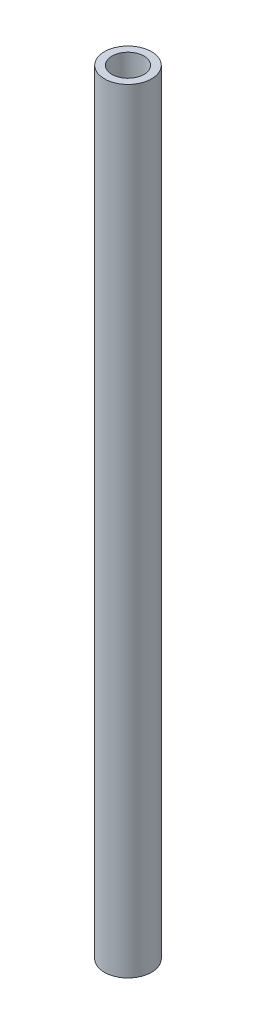
ISO-10303-21;
HEADER;
FILE_DESCRIPTION(('STEP AP214'),'2;1');
FILE_NAME('part.step','',(''),(''),'','','');
FILE_SCHEMA(('AUTOMOTIVE_DESIGN { 1 0 10303 214 1 1 1 1 }'));
ENDSEC;
DATA;
#1=APPLICATION_CONTEXT('core data for automotive mechanical design processes');
#2=APPLICATION_PROTOCOL_DEFINITION('international standard','automotive_design',2000,#1);
#3=PRODUCT_CONTEXT('',#1,'mechanical');
#4=PRODUCT('Part','Part','',(#3));
#5=PRODUCT_RELATED_PRODUCT_CATEGORY('part','',(#4));
#6=PRODUCT_DEFINITION_FORMATION('','',#4);
#7=PRODUCT_DEFINITION_CONTEXT('part definition',#1,'design');
#8=PRODUCT_DEFINITION('design','',#6,#7);
#9=PRODUCT_DEFINITION_SHAPE('','',#8);
#10=(LENGTH_UNIT() NAMED_UNIT(*) SI_UNIT(.MILLI.,.METRE.));
#11=(NAMED_UNIT(*) PLANE_ANGLE_UNIT() SI_UNIT($,.RADIAN.));
#12=(NAMED_UNIT(*) SI_UNIT($,.STERADIAN.) SOLID_ANGLE_UNIT());
#13=UNCERTAINTY_MEASURE_WITH_UNIT(LENGTH_MEASURE(1.E-05),#10,'distance_accuracy_value','');
#14=(GEOMETRIC_REPRESENTATION_CONTEXT(3) GLOBAL_UNCERTAINTY_ASSIGNED_CONTEXT((#13)) GLOBAL_UNIT_ASSIGNED_CONTEXT((#10,
#11,#12)) REPRESENTATION_CONTEXT('',''));
#15=CARTESIAN_POINT('',(0.,0.,0.));
#16=DIRECTION('',(0.,0.,1.));
#17=DIRECTION('',(1.,0.,0.));
#18=AXIS2_PLACEMENT_3D('',#15,#16,#17);
#19=CARTESIAN_POINT('',(0.,460.,0.));
#20=DIRECTION('',(0.,1.,0.));
#21=DIRECTION('',(0.,0.,1.));
#22=AXIS2_PLACEMENT_3D('',#19,#20,#21);
#23=PLANE('',#22);
#24=CARTESIAN_POINT('',(0.,460.,0.));
#25=DIRECTION('',(0.,1.,0.));
#26=DIRECTION('',(0.,0.,1.));
#27=AXIS2_PLACEMENT_3D('',#24,#25,#26);
#28=CIRCLE('',#27,14.);
#29=CARTESIAN_POINT('',(0.,460.,14.));
#30=VERTEX_POINT('',#29);
#31=EDGE_CURVE('E10',#30,#30,#28,.T.);
#32=ORIENTED_EDGE('',*,*,#31,.T.);
#33=EDGE_LOOP('',(#32));
#34=FACE_BOUND('',#33,.T.);
#35=CARTESIAN_POINT('',(0.,460.,0.));
#36=DIRECTION('',(0.,1.,0.));
#37=DIRECTION('',(0.,0.,1.));
#38=AXIS2_PLACEMENT_3D('',#35,#36,#37);
#39=CIRCLE('',#38,9.5);
#40=CARTESIAN_POINT('',(0.,460.,9.5));
#41=VERTEX_POINT('',#40);
#42=EDGE_CURVE('E42',#41,#41,#39,.T.);
#43=ORIENTED_EDGE('',*,*,#42,.F.);
#44=EDGE_LOOP('',(#43));
#45=FACE_BOUND('',#44,.T.);
#46=ADVANCED_FACE('F31',(#34,#45),#23,.T.);
#47=CARTESIAN_POINT('',(0.,0.,0.));
#48=DIRECTION('',(0.,1.,0.));
#49=DIRECTION('',(0.,0.,1.));
#50=AXIS2_PLACEMENT_3D('',#47,#48,#49);
#51=PLANE('',#50);
#52=CARTESIAN_POINT('',(0.,0.,0.));
#53=DIRECTION('',(0.,1.,0.));
#54=DIRECTION('',(0.,0.,1.));
#55=AXIS2_PLACEMENT_3D('',#52,#53,#54);
#56=CIRCLE('',#55,14.);
#57=CARTESIAN_POINT('',(0.,0.,14.));
#58=VERTEX_POINT('',#57);
#59=EDGE_CURVE('E35',#58,#58,#56,.T.);
#60=ORIENTED_EDGE('',*,*,#59,.F.);
#61=EDGE_LOOP('',(#60));
#62=FACE_BOUND('',#61,.T.);
#63=CARTESIAN_POINT('',(0.,0.,0.));
#64=DIRECTION('',(0.,1.,0.));
#65=DIRECTION('',(0.,0.,1.));
#66=AXIS2_PLACEMENT_3D('',#63,#64,#65);
#67=CIRCLE('',#66,9.5);
#68=CARTESIAN_POINT('',(0.,0.,9.5));
#69=VERTEX_POINT('',#68);
#70=EDGE_CURVE('E44',#69,#69,#67,.T.);
#71=ORIENTED_EDGE('',*,*,#70,.T.);
#72=EDGE_LOOP('',(#71));
#73=FACE_BOUND('',#72,.T.);
#74=ADVANCED_FACE('F54',(#62,#73),#51,.F.);
#75=CARTESIAN_POINT('',(0.,460.,0.));
#76=DIRECTION('',(0.,-1.,0.));
#77=DIRECTION('',(0.,0.,-1.));
#78=AXIS2_PLACEMENT_3D('',#75,#76,#77);
#79=CYLINDRICAL_SURFACE('',#78,14.);
#80=ORIENTED_EDGE('',*,*,#31,.F.);
#81=EDGE_LOOP('',(#80));
#82=FACE_BOUND('',#81,.T.);
#83=ORIENTED_EDGE('',*,*,#59,.T.);
#84=EDGE_LOOP('',(#83));
#85=FACE_BOUND('',#84,.T.);
#86=ADVANCED_FACE('F33',(#82,#85),#79,.T.);
#87=CARTESIAN_POINT('',(0.,460.,0.));
#88=DIRECTION('',(0.,-1.,0.));
#89=DIRECTION('',(0.,0.,-1.));
#90=AXIS2_PLACEMENT_3D('',#87,#88,#89);
#91=CYLINDRICAL_SURFACE('',#90,9.5);
#92=ORIENTED_EDGE('',*,*,#42,.T.);
#93=EDGE_LOOP('',(#92));
#94=FACE_BOUND('',#93,.T.);
#95=ORIENTED_EDGE('',*,*,#70,.F.);
#96=EDGE_LOOP('',(#95));
#97=FACE_BOUND('',#96,.T.);
#98=ADVANCED_FACE('F50',(#94,#97),#91,.F.);
#99=CLOSED_SHELL('',(#46,#74,#86,#98));
#100=MANIFOLD_SOLID_BREP('B2',#99);
#101=ADVANCED_BREP_SHAPE_REPRESENTATION('',(#18,#100),#14);
#102=SHAPE_DEFINITION_REPRESENTATION(#9,#101);
ENDSEC;
END-ISO-10303-21;
